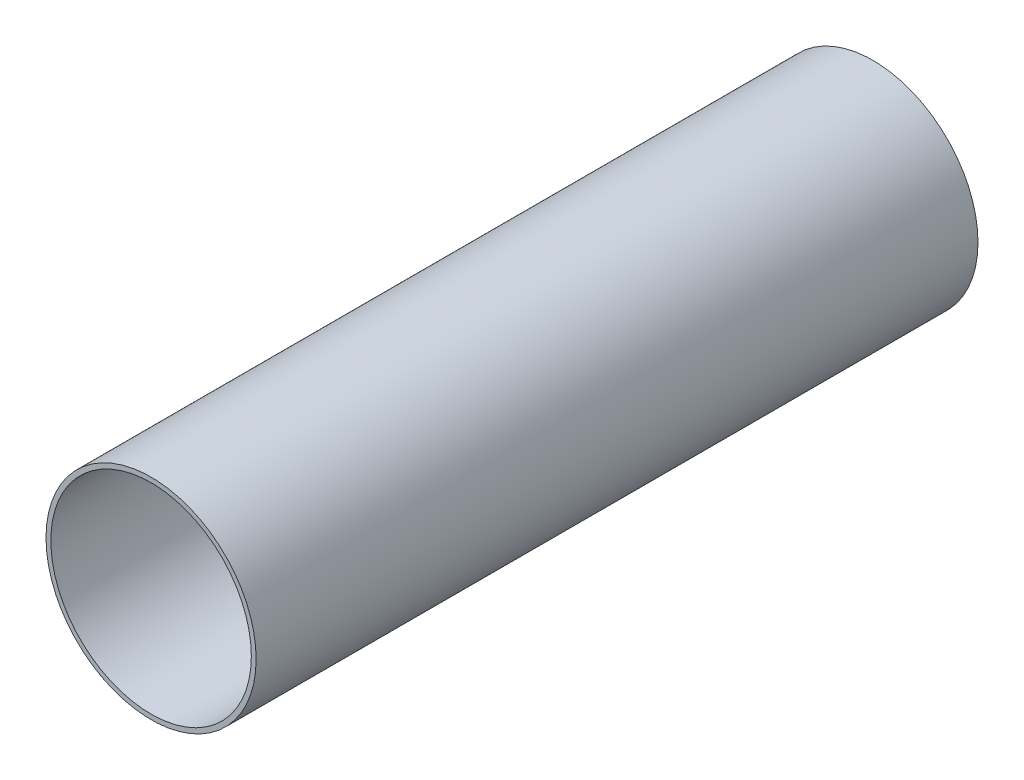
ISO-10303-21;
HEADER;
FILE_DESCRIPTION(('STEP AP214'),'2;1');
FILE_NAME('part.step','',(''),(''),'','','');
FILE_SCHEMA(('AUTOMOTIVE_DESIGN { 1 0 10303 214 1 1 1 1 }'));
ENDSEC;
DATA;
#1=APPLICATION_CONTEXT('core data for automotive mechanical design processes');
#2=APPLICATION_PROTOCOL_DEFINITION('international standard','automotive_design',2000,#1);
#3=PRODUCT_CONTEXT('',#1,'mechanical');
#4=PRODUCT('Part','Part','',(#3));
#5=PRODUCT_RELATED_PRODUCT_CATEGORY('part','',(#4));
#6=PRODUCT_DEFINITION_FORMATION('','',#4);
#7=PRODUCT_DEFINITION_CONTEXT('part definition',#1,'design');
#8=PRODUCT_DEFINITION('design','',#6,#7);
#9=PRODUCT_DEFINITION_SHAPE('','',#8);
#10=(LENGTH_UNIT() NAMED_UNIT(*) SI_UNIT(.MILLI.,.METRE.));
#11=(NAMED_UNIT(*) PLANE_ANGLE_UNIT() SI_UNIT($,.RADIAN.));
#12=(NAMED_UNIT(*) SI_UNIT($,.STERADIAN.) SOLID_ANGLE_UNIT());
#13=UNCERTAINTY_MEASURE_WITH_UNIT(LENGTH_MEASURE(1.E-05),#10,'distance_accuracy_value','');
#14=(GEOMETRIC_REPRESENTATION_CONTEXT(3) GLOBAL_UNCERTAINTY_ASSIGNED_CONTEXT((#13)) GLOBAL_UNIT_ASSIGNED_CONTEXT((#10,
#11,#12)) REPRESENTATION_CONTEXT('',''));
#15=CARTESIAN_POINT('',(0.,0.,0.));
#16=DIRECTION('',(0.,0.,1.));
#17=DIRECTION('',(1.,0.,0.));
#18=AXIS2_PLACEMENT_3D('',#15,#16,#17);
#19=CARTESIAN_POINT('',(0.,0.,228.6));
#20=DIRECTION('',(0.,0.,1.));
#21=DIRECTION('',(1.,0.,0.));
#22=AXIS2_PLACEMENT_3D('',#19,#20,#21);
#23=PLANE('',#22);
#24=CARTESIAN_POINT('',(0.,0.,228.6));
#25=DIRECTION('',(0.,0.,1.));
#26=DIRECTION('',(1.,0.,0.));
#27=AXIS2_PLACEMENT_3D('',#24,#25,#26);
#28=CIRCLE('',#27,33.274);
#29=CARTESIAN_POINT('',(33.274,0.,228.6));
#30=VERTEX_POINT('',#29);
#31=EDGE_CURVE('E10',#30,#30,#28,.T.);
#32=ORIENTED_EDGE('',*,*,#31,.T.);
#33=EDGE_LOOP('',(#32));
#34=FACE_BOUND('',#33,.T.);
#35=CARTESIAN_POINT('',(0.,0.,228.6));
#36=DIRECTION('',(0.,0.,1.));
#37=DIRECTION('',(1.,0.,0.));
#38=AXIS2_PLACEMENT_3D('',#35,#36,#37);
#39=CIRCLE('',#38,31.75);
#40=CARTESIAN_POINT('',(31.75,0.,228.6));
#41=VERTEX_POINT('',#40);
#42=EDGE_CURVE('E41',#41,#41,#39,.T.);
#43=ORIENTED_EDGE('',*,*,#42,.F.);
#44=EDGE_LOOP('',(#43));
#45=FACE_BOUND('',#44,.T.);
#46=ADVANCED_FACE('F30',(#34,#45),#23,.T.);
#47=CARTESIAN_POINT('',(0.,0.,0.));
#48=DIRECTION('',(0.,0.,1.));
#49=DIRECTION('',(1.,0.,0.));
#50=AXIS2_PLACEMENT_3D('',#47,#48,#49);
#51=PLANE('',#50);
#52=CARTESIAN_POINT('',(0.,0.,0.));
#53=DIRECTION('',(0.,0.,1.));
#54=DIRECTION('',(1.,0.,0.));
#55=AXIS2_PLACEMENT_3D('',#52,#53,#54);
#56=CIRCLE('',#55,33.274);
#57=CARTESIAN_POINT('',(33.274,0.,0.));
#58=VERTEX_POINT('',#57);
#59=EDGE_CURVE('E34',#58,#58,#56,.T.);
#60=ORIENTED_EDGE('',*,*,#59,.F.);
#61=EDGE_LOOP('',(#60));
#62=FACE_BOUND('',#61,.T.);
#63=CARTESIAN_POINT('',(0.,0.,0.));
#64=DIRECTION('',(0.,0.,1.));
#65=DIRECTION('',(1.,0.,0.));
#66=AXIS2_PLACEMENT_3D('',#63,#64,#65);
#67=CIRCLE('',#66,31.75);
#68=CARTESIAN_POINT('',(31.75,0.,0.));
#69=VERTEX_POINT('',#68);
#70=EDGE_CURVE('E43',#69,#69,#67,.T.);
#71=ORIENTED_EDGE('',*,*,#70,.T.);
#72=EDGE_LOOP('',(#71));
#73=FACE_BOUND('',#72,.T.);
#74=ADVANCED_FACE('F53',(#62,#73),#51,.F.);
#75=CARTESIAN_POINT('',(0.,0.,228.6));
#76=DIRECTION('',(0.,0.,-1.));
#77=DIRECTION('',(-1.,0.,0.));
#78=AXIS2_PLACEMENT_3D('',#75,#76,#77);
#79=CYLINDRICAL_SURFACE('',#78,33.274);
#80=ORIENTED_EDGE('',*,*,#31,.F.);
#81=EDGE_LOOP('',(#80));
#82=FACE_BOUND('',#81,.T.);
#83=ORIENTED_EDGE('',*,*,#59,.T.);
#84=EDGE_LOOP('',(#83));
#85=FACE_BOUND('',#84,.T.);
#86=ADVANCED_FACE('F32',(#82,#85),#79,.T.);
#87=CARTESIAN_POINT('',(0.,0.,228.6));
#88=DIRECTION('',(0.,0.,-1.));
#89=DIRECTION('',(-1.,0.,0.));
#90=AXIS2_PLACEMENT_3D('',#87,#88,#89);
#91=CYLINDRICAL_SURFACE('',#90,31.75);
#92=ORIENTED_EDGE('',*,*,#42,.T.);
#93=EDGE_LOOP('',(#92));
#94=FACE_BOUND('',#93,.T.);
#95=ORIENTED_EDGE('',*,*,#70,.F.);
#96=EDGE_LOOP('',(#95));
#97=FACE_BOUND('',#96,.T.);
#98=ADVANCED_FACE('F49',(#94,#97),#91,.F.);
#99=CLOSED_SHELL('',(#46,#74,#86,#98));
#100=MANIFOLD_SOLID_BREP('B2',#99);
#101=ADVANCED_BREP_SHAPE_REPRESENTATION('',(#18,#100),#14);
#102=SHAPE_DEFINITION_REPRESENTATION(#9,#101);
ENDSEC;
END-ISO-10303-21;
